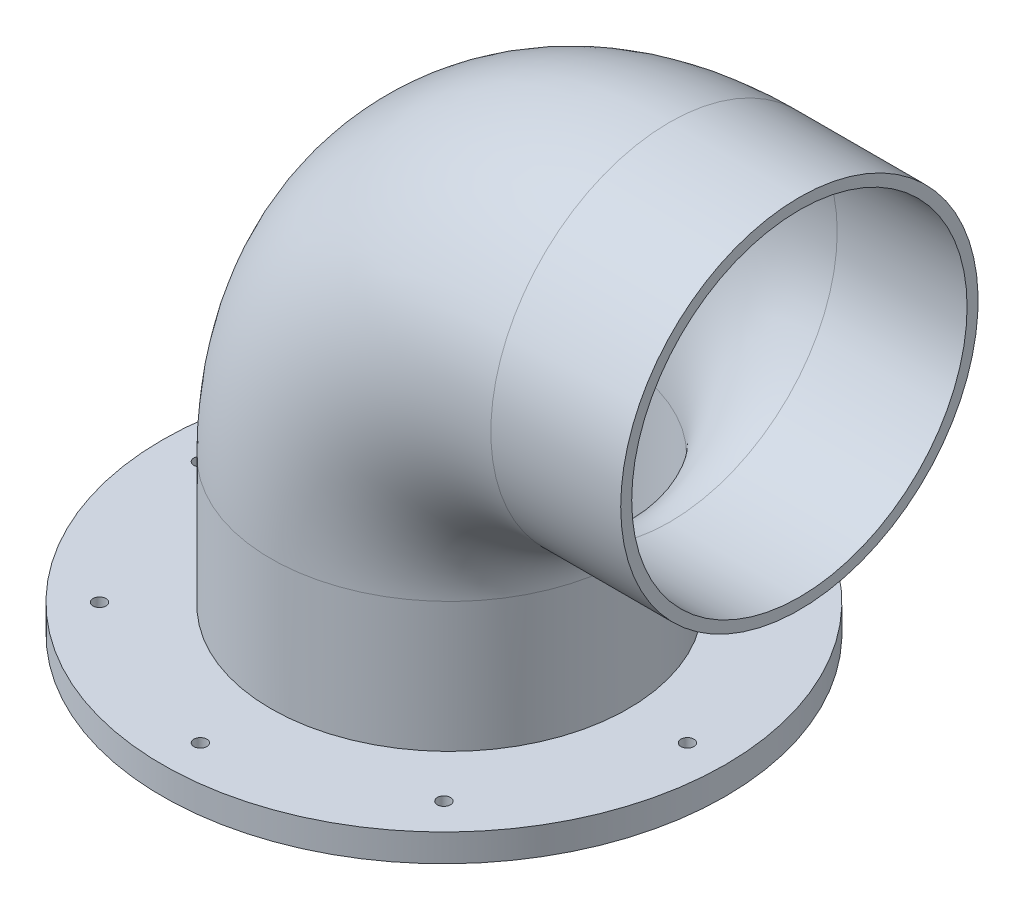
ISO-10303-21;
HEADER;
FILE_DESCRIPTION(('STEP AP214'),'2;1');
FILE_NAME('part.step','',(''),(''),'','','');
FILE_SCHEMA(('AUTOMOTIVE_DESIGN { 1 0 10303 214 1 1 1 1 }'));
ENDSEC;
DATA;
#1=APPLICATION_CONTEXT('core data for automotive mechanical design processes');
#2=APPLICATION_PROTOCOL_DEFINITION('international standard','automotive_design',2000,#1);
#3=PRODUCT_CONTEXT('',#1,'mechanical');
#4=PRODUCT('Part','Part','',(#3));
#5=PRODUCT_RELATED_PRODUCT_CATEGORY('part','',(#4));
#6=PRODUCT_DEFINITION_FORMATION('','',#4);
#7=PRODUCT_DEFINITION_CONTEXT('part definition',#1,'design');
#8=PRODUCT_DEFINITION('design','',#6,#7);
#9=PRODUCT_DEFINITION_SHAPE('','',#8);
#10=(LENGTH_UNIT() NAMED_UNIT(*) SI_UNIT(.MILLI.,.METRE.));
#11=(NAMED_UNIT(*) PLANE_ANGLE_UNIT() SI_UNIT($,.RADIAN.));
#12=(NAMED_UNIT(*) SI_UNIT($,.STERADIAN.) SOLID_ANGLE_UNIT());
#13=UNCERTAINTY_MEASURE_WITH_UNIT(LENGTH_MEASURE(1.E-05),#10,'distance_accuracy_value','');
#14=(GEOMETRIC_REPRESENTATION_CONTEXT(3) GLOBAL_UNCERTAINTY_ASSIGNED_CONTEXT((#13)) GLOBAL_UNIT_ASSIGNED_CONTEXT((#10,
#11,#12)) REPRESENTATION_CONTEXT('',''));
#15=CARTESIAN_POINT('',(0.,0.,0.));
#16=DIRECTION('',(0.,0.,1.));
#17=DIRECTION('',(1.,0.,0.));
#18=AXIS2_PLACEMENT_3D('',#15,#16,#17);
#19=CARTESIAN_POINT('',(82.1134168642502,92.3007855995872,0.));
#20=DIRECTION('',(-1.,0.,0.));
#21=DIRECTION('',(0.,0.,1.));
#22=AXIS2_PLACEMENT_3D('',#19,#20,#21);
#23=PLANE('',#22);
#24=CARTESIAN_POINT('',(82.1134168642502,92.3007855995872,0.));
#25=DIRECTION('',(-1.,0.,0.));
#26=DIRECTION('',(0.,0.,1.));
#27=AXIS2_PLACEMENT_3D('',#24,#25,#26);
#28=CIRCLE('',#27,38.735);
#29=CARTESIAN_POINT('',(82.1134168642502,92.3007855995872,38.735));
#30=VERTEX_POINT('',#29);
#31=EDGE_CURVE('E98',#30,#30,#28,.T.);
#32=ORIENTED_EDGE('',*,*,#31,.T.);
#33=EDGE_LOOP('',(#32));
#34=FACE_BOUND('',#33,.T.);
#35=CARTESIAN_POINT('',(82.1134168642502,92.3007855995872,0.));
#36=DIRECTION('',(-1.,0.,0.));
#37=DIRECTION('',(0.,0.,1.));
#38=AXIS2_PLACEMENT_3D('',#35,#36,#37);
#39=CIRCLE('',#38,41.275);
#40=CARTESIAN_POINT('',(82.1134168642502,92.3007855995872,41.275));
#41=VERTEX_POINT('',#40);
#42=EDGE_CURVE('E12',#41,#41,#39,.T.);
#43=ORIENTED_EDGE('',*,*,#42,.F.);
#44=EDGE_LOOP('',(#43));
#45=FACE_BOUND('',#44,.T.);
#46=ADVANCED_FACE('F57',(#34,#45),#23,.F.);
#47=CARTESIAN_POINT('',(1.31341686425018,11.5007855995872,0.));
#48=DIRECTION('',(0.,1.,0.));
#49=DIRECTION('',(-1.,0.,0.));
#50=AXIS2_PLACEMENT_3D('',#47,#48,#49);
#51=CYLINDRICAL_SURFACE('',#50,41.275);
#52=CARTESIAN_POINT('',(1.31341686425017,41.5007855995872,0.));
#53=DIRECTION('',(0.,-1.,0.));
#54=DIRECTION('',(0.,0.,1.));
#55=AXIS2_PLACEMENT_3D('',#52,#53,#54);
#56=CIRCLE('',#55,41.275);
#57=CARTESIAN_POINT('',(-39.9615831357498,41.5007855995872,0.));
#58=VERTEX_POINT('',#57);
#59=EDGE_CURVE('E104',#58,#58,#56,.T.);
#60=ORIENTED_EDGE('',*,*,#59,.T.);
#61=EDGE_LOOP('',(#60));
#62=FACE_BOUND('',#61,.T.);
#63=CARTESIAN_POINT('',(1.31341686425018,11.5007855995872,0.));
#64=DIRECTION('',(0.,-1.,0.));
#65=DIRECTION('',(0.,0.,1.));
#66=AXIS2_PLACEMENT_3D('',#63,#64,#65);
#67=CIRCLE('',#66,41.275);
#68=CARTESIAN_POINT('',(1.31341686425018,11.5007855995872,41.275));
#69=VERTEX_POINT('',#68);
#70=EDGE_CURVE('E101',#69,#69,#67,.T.);
#71=ORIENTED_EDGE('',*,*,#70,.F.);
#72=EDGE_LOOP('',(#71));
#73=FACE_BOUND('',#72,.T.);
#74=ADVANCED_FACE('F123',(#62,#73),#51,.T.);
#75=CARTESIAN_POINT('',(52.1134168642502,41.5007855995872,0.));
#76=DIRECTION('',(0.,0.,-1.));
#77=DIRECTION('',(-1.,0.,0.));
#78=AXIS2_PLACEMENT_3D('',#75,#76,#77);
#79=TOROIDAL_SURFACE('',#78,50.8,41.275);
#80=CARTESIAN_POINT('',(52.1134168642502,92.3007855995873,0.));
#81=DIRECTION('',(-1.,0.,0.));
#82=DIRECTION('',(0.,0.,1.));
#83=AXIS2_PLACEMENT_3D('',#80,#81,#82);
#84=CIRCLE('',#83,41.275);
#85=CARTESIAN_POINT('',(52.1134168642502,133.575785599587,0.));
#86=VERTEX_POINT('',#85);
#87=EDGE_CURVE('E64',#86,#86,#84,.T.);
#88=CARTESIAN_POINT('',(52.1134168642502,41.5007855995872,0.));
#89=DIRECTION('',(0.,0.,-1.));
#90=DIRECTION('',(-1.,0.,0.));
#91=AXIS2_PLACEMENT_3D('',#88,#89,#90);
#92=CIRCLE('',#91,92.075);
#93=EDGE_CURVE('',#58,#86,#92,.T.);
#94=ORIENTED_EDGE('',*,*,#59,.F.);
#95=ORIENTED_EDGE('',*,*,#87,.T.);
#96=ORIENTED_EDGE('',*,*,#93,.T.);
#97=ORIENTED_EDGE('',*,*,#93,.F.);
#98=EDGE_LOOP('',(#94,#96,#95,#97));
#99=FACE_BOUND('',#98,.T.);
#100=ADVANCED_FACE('F109',(#99),#79,.T.);
#101=CARTESIAN_POINT('',(52.1134168642502,92.3007855995872,0.));
#102=DIRECTION('',(1.,0.,0.));
#103=DIRECTION('',(0.,0.,-1.));
#104=AXIS2_PLACEMENT_3D('',#101,#102,#103);
#105=CYLINDRICAL_SURFACE('',#104,41.275);
#106=ORIENTED_EDGE('',*,*,#42,.T.);
#107=EDGE_LOOP('',(#106));
#108=FACE_BOUND('',#107,.T.);
#109=ORIENTED_EDGE('',*,*,#87,.F.);
#110=EDGE_LOOP('',(#109));
#111=FACE_BOUND('',#110,.T.);
#112=ADVANCED_FACE('F112',(#108,#111),#105,.T.);
#113=CARTESIAN_POINT('',(1.31341686425018,11.5007855995872,0.));
#114=DIRECTION('',(0.,1.,0.));
#115=DIRECTION('',(-1.,0.,0.));
#116=AXIS2_PLACEMENT_3D('',#113,#114,#115);
#117=CYLINDRICAL_SURFACE('',#116,38.735);
#118=CARTESIAN_POINT('',(1.31341686425017,41.5007855995872,0.));
#119=DIRECTION('',(0.,1.,0.));
#120=DIRECTION('',(-1.,0.,0.));
#121=AXIS2_PLACEMENT_3D('',#118,#119,#120);
#122=CIRCLE('',#121,38.735);
#123=CARTESIAN_POINT('',(-37.4215831357498,41.5007855995872,0.));
#124=VERTEX_POINT('',#123);
#125=EDGE_CURVE('E92',#124,#124,#122,.F.);
#126=ORIENTED_EDGE('',*,*,#125,.F.);
#127=EDGE_LOOP('',(#126));
#128=FACE_BOUND('',#127,.T.);
#129=CARTESIAN_POINT('',(1.31341686425018,11.5007855995872,0.));
#130=DIRECTION('',(0.,-1.,0.));
#131=DIRECTION('',(1.,0.,0.));
#132=AXIS2_PLACEMENT_3D('',#129,#130,#131);
#133=CIRCLE('',#132,38.735);
#134=CARTESIAN_POINT('',(-17.9170689907245,11.5007855995872,33.6242269618443));
#135=VERTEX_POINT('',#134);
#136=CARTESIAN_POINT('',(-17.9170689907245,11.5007855995872,-33.6242269618444));
#137=VERTEX_POINT('',#136);
#138=EDGE_CURVE('E84',#135,#137,#133,.T.);
#139=ORIENTED_EDGE('',*,*,#138,.T.);
#140=EDGE_CURVE('E86',#137,#135,#133,.T.);
#141=ORIENTED_EDGE('',*,*,#140,.T.);
#142=EDGE_LOOP('',(#139,#141));
#143=FACE_BOUND('',#142,.T.);
#144=ADVANCED_FACE('F91',(#128,#143),#117,.F.);
#145=CARTESIAN_POINT('',(52.1134168642502,41.5007855995872,0.));
#146=DIRECTION('',(0.,0.,-1.));
#147=DIRECTION('',(-1.,0.,0.));
#148=AXIS2_PLACEMENT_3D('',#145,#146,#147);
#149=TOROIDAL_SURFACE('',#148,50.8,38.735);
#150=CARTESIAN_POINT('',(52.1134168642502,92.3007855995872,0.));
#151=DIRECTION('',(-1.,0.,0.));
#152=DIRECTION('',(0.,-1.,0.));
#153=AXIS2_PLACEMENT_3D('',#150,#151,#152);
#154=CIRCLE('',#153,38.735);
#155=CARTESIAN_POINT('',(52.1134168642502,131.035785599587,0.));
#156=VERTEX_POINT('',#155);
#157=EDGE_CURVE('E94',#156,#156,#154,.T.);
#158=CARTESIAN_POINT('',(52.1134168642502,41.5007855995872,0.));
#159=DIRECTION('',(0.,0.,-1.));
#160=DIRECTION('',(-1.,0.,0.));
#161=AXIS2_PLACEMENT_3D('',#158,#159,#160);
#162=CIRCLE('',#161,89.535);
#163=EDGE_CURVE('',#124,#156,#162,.T.);
#164=ORIENTED_EDGE('',*,*,#125,.T.);
#165=ORIENTED_EDGE('',*,*,#157,.F.);
#166=ORIENTED_EDGE('',*,*,#163,.T.);
#167=ORIENTED_EDGE('',*,*,#163,.F.);
#168=EDGE_LOOP('',(#164,#166,#165,#167));
#169=FACE_BOUND('',#168,.T.);
#170=ADVANCED_FACE('F119',(#169),#149,.F.);
#171=CARTESIAN_POINT('',(52.1134168642502,92.3007855995872,0.));
#172=DIRECTION('',(1.,0.,0.));
#173=DIRECTION('',(0.,0.,-1.));
#174=AXIS2_PLACEMENT_3D('',#171,#172,#173);
#175=CYLINDRICAL_SURFACE('',#174,38.735);
#176=ORIENTED_EDGE('',*,*,#31,.F.);
#177=EDGE_LOOP('',(#176));
#178=FACE_BOUND('',#177,.T.);
#179=ORIENTED_EDGE('',*,*,#157,.T.);
#180=EDGE_LOOP('',(#179));
#181=FACE_BOUND('',#180,.T.);
#182=ADVANCED_FACE('F129',(#178,#181),#175,.F.);
#183=CARTESIAN_POINT('',(0.,11.5007855995872,0.));
#184=DIRECTION('',(0.,-1.,0.));
#185=DIRECTION('',(1.,0.,0.));
#186=AXIS2_PLACEMENT_3D('',#183,#184,#185);
#187=PLANE('',#186);
#188=CARTESIAN_POINT('',(-56.25,11.5007855995872,-1.96395825309926E-13));
#189=DIRECTION('',(0.,-1.,0.));
#190=DIRECTION('',(1.,0.,0.));
#191=AXIS2_PLACEMENT_3D('',#188,#189,#190);
#192=CIRCLE('',#191,1.5);
#193=CARTESIAN_POINT('',(-54.75,11.5007855995872,-1.96395825309926E-13));
#194=VERTEX_POINT('',#193);
#195=EDGE_CURVE('E208',#194,#194,#192,.T.);
#196=ORIENTED_EDGE('',*,*,#195,.T.);
#197=EDGE_LOOP('',(#196));
#198=FACE_BOUND('',#197,.T.);
#199=CARTESIAN_POINT('',(-39.7747564417431,11.5007855995872,-39.7747564417435));
#200=DIRECTION('',(0.,-1.,0.));
#201=DIRECTION('',(1.,0.,0.));
#202=AXIS2_PLACEMENT_3D('',#199,#200,#201);
#203=CIRCLE('',#202,1.5);
#204=CARTESIAN_POINT('',(-38.2747564417431,11.5007855995872,-39.7747564417435));
#205=VERTEX_POINT('',#204);
#206=EDGE_CURVE('E205',#205,#205,#203,.T.);
#207=ORIENTED_EDGE('',*,*,#206,.T.);
#208=EDGE_LOOP('',(#207));
#209=FACE_BOUND('',#208,.T.);
#210=CARTESIAN_POINT('',(0.,11.5007855995872,-56.25));
#211=DIRECTION('',(0.,-1.,0.));
#212=DIRECTION('',(1.,0.,0.));
#213=AXIS2_PLACEMENT_3D('',#210,#211,#212);
#214=CIRCLE('',#213,1.5);
#215=CARTESIAN_POINT('',(1.5,11.5007855995872,-56.25));
#216=VERTEX_POINT('',#215);
#217=EDGE_CURVE('E196',#216,#216,#214,.T.);
#218=ORIENTED_EDGE('',*,*,#217,.T.);
#219=EDGE_LOOP('',(#218));
#220=FACE_BOUND('',#219,.T.);
#221=CARTESIAN_POINT('',(39.7747564417436,11.5007855995872,-39.774756441743));
#222=DIRECTION('',(0.,-1.,0.));
#223=DIRECTION('',(1.,0.,0.));
#224=AXIS2_PLACEMENT_3D('',#221,#222,#223);
#225=CIRCLE('',#224,1.5);
#226=CARTESIAN_POINT('',(41.2747564417436,11.5007855995872,-39.774756441743));
#227=VERTEX_POINT('',#226);
#228=EDGE_CURVE('E192',#227,#227,#225,.T.);
#229=ORIENTED_EDGE('',*,*,#228,.T.);
#230=EDGE_LOOP('',(#229));
#231=FACE_BOUND('',#230,.T.);
#232=CARTESIAN_POINT('',(56.25,11.5007855995872,5.89187475929779E-13));
#233=DIRECTION('',(0.,-1.,0.));
#234=DIRECTION('',(1.,0.,0.));
#235=AXIS2_PLACEMENT_3D('',#232,#233,#234);
#236=CIRCLE('',#235,1.5);
#237=CARTESIAN_POINT('',(57.75,11.5007855995872,5.89187475929779E-13));
#238=VERTEX_POINT('',#237);
#239=EDGE_CURVE('E190',#238,#238,#236,.T.);
#240=ORIENTED_EDGE('',*,*,#239,.T.);
#241=EDGE_LOOP('',(#240));
#242=FACE_BOUND('',#241,.T.);
#243=CARTESIAN_POINT('',(39.7747564417428,11.5007855995872,39.7747564417438));
#244=DIRECTION('',(0.,-1.,0.));
#245=DIRECTION('',(1.,0.,0.));
#246=AXIS2_PLACEMENT_3D('',#243,#244,#245);
#247=CIRCLE('',#246,1.5);
#248=CARTESIAN_POINT('',(41.2747564417428,11.5007855995872,39.7747564417438));
#249=VERTEX_POINT('',#248);
#250=EDGE_CURVE('E193',#249,#249,#247,.T.);
#251=ORIENTED_EDGE('',*,*,#250,.T.);
#252=EDGE_LOOP('',(#251));
#253=FACE_BOUND('',#252,.T.);
#254=CARTESIAN_POINT('',(-39.7747564417434,11.5007855995872,39.7747564417432));
#255=DIRECTION('',(0.,-1.,0.));
#256=DIRECTION('',(1.,0.,0.));
#257=AXIS2_PLACEMENT_3D('',#254,#255,#256);
#258=CIRCLE('',#257,1.5);
#259=CARTESIAN_POINT('',(-38.2747564417434,11.5007855995872,39.7747564417432));
#260=VERTEX_POINT('',#259);
#261=EDGE_CURVE('E199',#260,#260,#258,.T.);
#262=ORIENTED_EDGE('',*,*,#261,.T.);
#263=EDGE_LOOP('',(#262));
#264=FACE_BOUND('',#263,.T.);
#265=CARTESIAN_POINT('',(0.,11.5007855995872,56.25));
#266=DIRECTION('',(0.,-1.,0.));
#267=DIRECTION('',(1.,0.,0.));
#268=AXIS2_PLACEMENT_3D('',#265,#266,#267);
#269=CIRCLE('',#268,1.5);
#270=CARTESIAN_POINT('',(1.5,11.5007855995872,56.25));
#271=VERTEX_POINT('',#270);
#272=EDGE_CURVE('E214',#271,#271,#269,.T.);
#273=ORIENTED_EDGE('',*,*,#272,.T.);
#274=EDGE_LOOP('',(#273));
#275=FACE_BOUND('',#274,.T.);
#276=ORIENTED_EDGE('',*,*,#70,.T.);
#277=EDGE_LOOP('',(#276));
#278=FACE_BOUND('',#277,.T.);
#279=CARTESIAN_POINT('',(0.,11.5007855995872,0.));
#280=DIRECTION('',(0.,-1.,0.));
#281=DIRECTION('',(1.,0.,0.));
#282=AXIS2_PLACEMENT_3D('',#279,#280,#281);
#283=CIRCLE('',#282,65.);
#284=CARTESIAN_POINT('',(65.,11.5007855995872,0.));
#285=VERTEX_POINT('',#284);
#286=EDGE_CURVE('E85',#285,#285,#283,.T.);
#287=ORIENTED_EDGE('',*,*,#286,.F.);
#288=EDGE_LOOP('',(#287));
#289=FACE_BOUND('',#288,.T.);
#290=ADVANCED_FACE('F122',(#198,#209,#220,#231,#242,#253,#264,#275,#278,#289),#187,.F.);
#291=CARTESIAN_POINT('',(0.,5.15078559958724,0.));
#292=DIRECTION('',(0.,-1.,0.));
#293=DIRECTION('',(1.,0.,0.));
#294=AXIS2_PLACEMENT_3D('',#291,#292,#293);
#295=PLANE('',#294);
#296=CARTESIAN_POINT('',(-56.25,5.15078559958725,-1.96395825309926E-13));
#297=DIRECTION('',(0.,-1.,0.));
#298=DIRECTION('',(0.,0.,1.));
#299=AXIS2_PLACEMENT_3D('',#296,#297,#298);
#300=CIRCLE('',#299,1.5);
#301=CARTESIAN_POINT('',(-56.25,5.15078559958725,1.4999999999998));
#302=VERTEX_POINT('',#301);
#303=EDGE_CURVE('E253',#302,#302,#300,.T.);
#304=ORIENTED_EDGE('',*,*,#303,.F.);
#305=EDGE_LOOP('',(#304));
#306=FACE_BOUND('',#305,.T.);
#307=CARTESIAN_POINT('',(-39.7747564417431,5.15078559958725,-39.7747564417435));
#308=DIRECTION('',(0.,-1.,0.));
#309=DIRECTION('',(-0.707106781186551,0.,0.707106781186544));
#310=AXIS2_PLACEMENT_3D('',#307,#308,#309);
#311=CIRCLE('',#310,1.5);
#312=CARTESIAN_POINT('',(-40.8354166135229,5.15078559958725,-38.7140962699637));
#313=VERTEX_POINT('',#312);
#314=EDGE_CURVE('E262',#313,#313,#311,.T.);
#315=ORIENTED_EDGE('',*,*,#314,.F.);
#316=EDGE_LOOP('',(#315));
#317=FACE_BOUND('',#316,.T.);
#318=CARTESIAN_POINT('',(0.,5.15078559958724,-56.25));
#319=DIRECTION('',(0.,-1.,0.));
#320=DIRECTION('',(-1.,0.,0.));
#321=AXIS2_PLACEMENT_3D('',#318,#319,#320);
#322=CIRCLE('',#321,1.5);
#323=CARTESIAN_POINT('',(-1.5,5.15078559958724,-56.25));
#324=VERTEX_POINT('',#323);
#325=EDGE_CURVE('E259',#324,#324,#322,.T.);
#326=ORIENTED_EDGE('',*,*,#325,.F.);
#327=EDGE_LOOP('',(#326));
#328=FACE_BOUND('',#327,.T.);
#329=CARTESIAN_POINT('',(39.7747564417436,5.15078559958723,-39.774756441743));
#330=DIRECTION('',(0.,-1.,0.));
#331=DIRECTION('',(-0.707106781186541,0.,-0.707106781186554));
#332=AXIS2_PLACEMENT_3D('',#329,#330,#331);
#333=CIRCLE('',#332,1.5);
#334=CARTESIAN_POINT('',(38.7140962699638,5.15078559958723,-40.8354166135228));
#335=VERTEX_POINT('',#334);
#336=EDGE_CURVE('E256',#335,#335,#333,.T.);
#337=ORIENTED_EDGE('',*,*,#336,.F.);
#338=EDGE_LOOP('',(#337));
#339=FACE_BOUND('',#338,.T.);
#340=CARTESIAN_POINT('',(56.25,5.15078559958723,5.89187475929779E-13));
#341=DIRECTION('',(0.,-1.,0.));
#342=DIRECTION('',(0.,0.,-1.));
#343=AXIS2_PLACEMENT_3D('',#340,#341,#342);
#344=CIRCLE('',#343,1.5);
#345=CARTESIAN_POINT('',(56.25,5.15078559958723,-1.49999999999941));
#346=VERTEX_POINT('',#345);
#347=EDGE_CURVE('E187',#346,#346,#344,.T.);
#348=ORIENTED_EDGE('',*,*,#347,.F.);
#349=EDGE_LOOP('',(#348));
#350=FACE_BOUND('',#349,.T.);
#351=CARTESIAN_POINT('',(39.7747564417428,5.15078559958723,39.7747564417438));
#352=DIRECTION('',(0.,-1.,0.));
#353=DIRECTION('',(0.707106781186556,0.,-0.707106781186539));
#354=AXIS2_PLACEMENT_3D('',#351,#352,#353);
#355=CIRCLE('',#354,1.5);
#356=CARTESIAN_POINT('',(40.8354166135226,5.15078559958723,38.714096269964));
#357=VERTEX_POINT('',#356);
#358=EDGE_CURVE('E267',#357,#357,#355,.T.);
#359=ORIENTED_EDGE('',*,*,#358,.F.);
#360=EDGE_LOOP('',(#359));
#361=FACE_BOUND('',#360,.T.);
#362=CARTESIAN_POINT('',(-39.7747564417434,5.15078559958725,39.7747564417432));
#363=DIRECTION('',(0.,-1.,0.));
#364=DIRECTION('',(0.707106781186546,0.,0.707106781186549));
#365=AXIS2_PLACEMENT_3D('',#362,#363,#364);
#366=CIRCLE('',#365,1.5);
#367=CARTESIAN_POINT('',(-38.7140962699636,5.15078559958725,40.8354166135231));
#368=VERTEX_POINT('',#367);
#369=EDGE_CURVE('E251',#368,#368,#366,.T.);
#370=ORIENTED_EDGE('',*,*,#369,.F.);
#371=EDGE_LOOP('',(#370));
#372=FACE_BOUND('',#371,.T.);
#373=CARTESIAN_POINT('',(0.,5.15078559958724,56.25));
#374=DIRECTION('',(0.,-1.,0.));
#375=DIRECTION('',(1.,0.,0.));
#376=AXIS2_PLACEMENT_3D('',#373,#374,#375);
#377=CIRCLE('',#376,1.5);
#378=CARTESIAN_POINT('',(1.5,5.15078559958724,56.25));
#379=VERTEX_POINT('',#378);
#380=EDGE_CURVE('E211',#379,#379,#377,.T.);
#381=ORIENTED_EDGE('',*,*,#380,.F.);
#382=EDGE_LOOP('',(#381));
#383=FACE_BOUND('',#382,.T.);
#384=CARTESIAN_POINT('',(0.,5.15078559958724,0.));
#385=DIRECTION('',(0.,-1.,0.));
#386=DIRECTION('',(1.,0.,0.));
#387=AXIS2_PLACEMENT_3D('',#384,#385,#386);
#388=CIRCLE('',#387,38.1);
#389=CARTESIAN_POINT('',(38.1,5.15078559958723,0.));
#390=VERTEX_POINT('',#389);
#391=EDGE_CURVE('E79',#390,#390,#388,.T.);
#392=ORIENTED_EDGE('',*,*,#391,.F.);
#393=EDGE_LOOP('',(#392));
#394=FACE_BOUND('',#393,.T.);
#395=CARTESIAN_POINT('',(0.,5.15078559958724,0.));
#396=DIRECTION('',(0.,-1.,0.));
#397=DIRECTION('',(1.,0.,0.));
#398=AXIS2_PLACEMENT_3D('',#395,#396,#397);
#399=CIRCLE('',#398,65.);
#400=CARTESIAN_POINT('',(65.,5.15078559958723,0.));
#401=VERTEX_POINT('',#400);
#402=EDGE_CURVE('E89',#401,#401,#399,.T.);
#403=ORIENTED_EDGE('',*,*,#402,.T.);
#404=EDGE_LOOP('',(#403));
#405=FACE_BOUND('',#404,.T.);
#406=ADVANCED_FACE('F139',(#306,#317,#328,#339,#350,#361,#372,#383,#394,#405),#295,.T.);
#407=CARTESIAN_POINT('',(0.,5.15078559958724,0.));
#408=DIRECTION('',(0.,1.,0.));
#409=DIRECTION('',(-1.,0.,0.));
#410=AXIS2_PLACEMENT_3D('',#407,#408,#409);
#411=CYLINDRICAL_SURFACE('',#410,65.);
#412=ORIENTED_EDGE('',*,*,#402,.F.);
#413=EDGE_LOOP('',(#412));
#414=FACE_BOUND('',#413,.T.);
#415=ORIENTED_EDGE('',*,*,#286,.T.);
#416=EDGE_LOOP('',(#415));
#417=FACE_BOUND('',#416,.T.);
#418=ADVANCED_FACE('F136',(#414,#417),#411,.T.);
#419=ORIENTED_EDGE('',*,*,#140,.F.);
#420=CARTESIAN_POINT('',(0.,11.5007855995872,0.));
#421=DIRECTION('',(0.,-1.,0.));
#422=DIRECTION('',(1.,0.,0.));
#423=AXIS2_PLACEMENT_3D('',#420,#421,#422);
#424=CIRCLE('',#423,38.1);
#425=EDGE_CURVE('E73',#137,#135,#424,.T.);
#426=ORIENTED_EDGE('',*,*,#425,.T.);
#427=EDGE_LOOP('',(#419,#426));
#428=FACE_BOUND('',#427,.T.);
#429=ADVANCED_FACE('F87',(#428),#187,.F.);
#430=CARTESIAN_POINT('',(0.,11.5007855995872,0.));
#431=DIRECTION('',(0.,-1.,0.));
#432=DIRECTION('',(1.,0.,0.));
#433=AXIS2_PLACEMENT_3D('',#430,#431,#432);
#434=CYLINDRICAL_SURFACE('',#433,38.1);
#435=EDGE_CURVE('E70',#135,#137,#424,.T.);
#436=ORIENTED_EDGE('',*,*,#435,.F.);
#437=ORIENTED_EDGE('',*,*,#425,.F.);
#438=EDGE_LOOP('',(#436,#437));
#439=FACE_BOUND('',#438,.T.);
#440=ORIENTED_EDGE('',*,*,#391,.T.);
#441=EDGE_LOOP('',(#440));
#442=FACE_BOUND('',#441,.T.);
#443=ADVANCED_FACE('F74',(#439,#442),#434,.F.);
#444=CARTESIAN_POINT('',(0.,11.5007855995872,0.));
#445=DIRECTION('',(0.,-1.,0.));
#446=DIRECTION('',(1.,0.,0.));
#447=AXIS2_PLACEMENT_3D('',#444,#445,#446);
#448=PLANE('',#447);
#449=ORIENTED_EDGE('',*,*,#435,.T.);
#450=ORIENTED_EDGE('',*,*,#138,.F.);
#451=EDGE_LOOP('',(#449,#450));
#452=FACE_BOUND('',#451,.T.);
#453=ADVANCED_FACE('F82',(#452),#448,.T.);
#454=CARTESIAN_POINT('',(0.,15.1507855995872,56.25));
#455=DIRECTION('',(0.,-1.,0.));
#456=DIRECTION('',(1.,0.,0.));
#457=AXIS2_PLACEMENT_3D('',#454,#455,#456);
#458=CYLINDRICAL_SURFACE('',#457,1.5);
#459=ORIENTED_EDGE('',*,*,#380,.T.);
#460=EDGE_LOOP('',(#459));
#461=FACE_BOUND('',#460,.T.);
#462=ORIENTED_EDGE('',*,*,#272,.F.);
#463=EDGE_LOOP('',(#462));
#464=FACE_BOUND('',#463,.T.);
#465=ADVANCED_FACE('F151',(#461,#464),#458,.F.);
#466=CARTESIAN_POINT('',(-39.7747564417434,15.1507855995872,39.7747564417432));
#467=DIRECTION('',(0.,-1.,0.));
#468=DIRECTION('',(1.,0.,0.));
#469=AXIS2_PLACEMENT_3D('',#466,#467,#468);
#470=CYLINDRICAL_SURFACE('',#469,1.5);
#471=ORIENTED_EDGE('',*,*,#369,.T.);
#472=EDGE_LOOP('',(#471));
#473=FACE_BOUND('',#472,.T.);
#474=ORIENTED_EDGE('',*,*,#261,.F.);
#475=EDGE_LOOP('',(#474));
#476=FACE_BOUND('',#475,.T.);
#477=ADVANCED_FACE('F154',(#473,#476),#470,.F.);
#478=CARTESIAN_POINT('',(39.7747564417428,15.1507855995872,39.7747564417438));
#479=DIRECTION('',(0.,-1.,0.));
#480=DIRECTION('',(1.,0.,0.));
#481=AXIS2_PLACEMENT_3D('',#478,#479,#480);
#482=CYLINDRICAL_SURFACE('',#481,1.5);
#483=ORIENTED_EDGE('',*,*,#358,.T.);
#484=EDGE_LOOP('',(#483));
#485=FACE_BOUND('',#484,.T.);
#486=ORIENTED_EDGE('',*,*,#250,.F.);
#487=EDGE_LOOP('',(#486));
#488=FACE_BOUND('',#487,.T.);
#489=ADVANCED_FACE('F158',(#485,#488),#482,.F.);
#490=CARTESIAN_POINT('',(56.25,15.1507855995872,5.89187475929779E-13));
#491=DIRECTION('',(0.,-1.,0.));
#492=DIRECTION('',(1.,0.,0.));
#493=AXIS2_PLACEMENT_3D('',#490,#491,#492);
#494=CYLINDRICAL_SURFACE('',#493,1.5);
#495=ORIENTED_EDGE('',*,*,#347,.T.);
#496=EDGE_LOOP('',(#495));
#497=FACE_BOUND('',#496,.T.);
#498=ORIENTED_EDGE('',*,*,#239,.F.);
#499=EDGE_LOOP('',(#498));
#500=FACE_BOUND('',#499,.T.);
#501=ADVANCED_FACE('F164',(#497,#500),#494,.F.);
#502=CARTESIAN_POINT('',(39.7747564417436,15.1507855995872,-39.774756441743));
#503=DIRECTION('',(0.,-1.,0.));
#504=DIRECTION('',(1.,0.,0.));
#505=AXIS2_PLACEMENT_3D('',#502,#503,#504);
#506=CYLINDRICAL_SURFACE('',#505,1.5);
#507=ORIENTED_EDGE('',*,*,#336,.T.);
#508=EDGE_LOOP('',(#507));
#509=FACE_BOUND('',#508,.T.);
#510=ORIENTED_EDGE('',*,*,#228,.F.);
#511=EDGE_LOOP('',(#510));
#512=FACE_BOUND('',#511,.T.);
#513=ADVANCED_FACE('F160',(#509,#512),#506,.F.);
#514=CARTESIAN_POINT('',(0.,15.1507855995872,-56.25));
#515=DIRECTION('',(0.,-1.,0.));
#516=DIRECTION('',(1.,0.,0.));
#517=AXIS2_PLACEMENT_3D('',#514,#515,#516);
#518=CYLINDRICAL_SURFACE('',#517,1.5);
#519=ORIENTED_EDGE('',*,*,#325,.T.);
#520=EDGE_LOOP('',(#519));
#521=FACE_BOUND('',#520,.T.);
#522=ORIENTED_EDGE('',*,*,#217,.F.);
#523=EDGE_LOOP('',(#522));
#524=FACE_BOUND('',#523,.T.);
#525=ADVANCED_FACE('F163',(#521,#524),#518,.F.);
#526=CARTESIAN_POINT('',(-39.7747564417431,15.1507855995872,-39.7747564417435));
#527=DIRECTION('',(0.,-1.,0.));
#528=DIRECTION('',(1.,0.,0.));
#529=AXIS2_PLACEMENT_3D('',#526,#527,#528);
#530=CYLINDRICAL_SURFACE('',#529,1.5);
#531=ORIENTED_EDGE('',*,*,#314,.T.);
#532=EDGE_LOOP('',(#531));
#533=FACE_BOUND('',#532,.T.);
#534=ORIENTED_EDGE('',*,*,#206,.F.);
#535=EDGE_LOOP('',(#534));
#536=FACE_BOUND('',#535,.T.);
#537=ADVANCED_FACE('F168',(#533,#536),#530,.F.);
#538=CARTESIAN_POINT('',(-56.25,15.1507855995873,-1.96395825309926E-13));
#539=DIRECTION('',(0.,-1.,0.));
#540=DIRECTION('',(1.,0.,0.));
#541=AXIS2_PLACEMENT_3D('',#538,#539,#540);
#542=CYLINDRICAL_SURFACE('',#541,1.5);
#543=ORIENTED_EDGE('',*,*,#303,.T.);
#544=EDGE_LOOP('',(#543));
#545=FACE_BOUND('',#544,.T.);
#546=ORIENTED_EDGE('',*,*,#195,.F.);
#547=EDGE_LOOP('',(#546));
#548=FACE_BOUND('',#547,.T.);
#549=ADVANCED_FACE('F172',(#545,#548),#542,.F.);
#550=CLOSED_SHELL('',(#46,#74,#100,#112,#144,#170,#182,#290,#406,#418,#429,#443,#453,#465,#477,
#489,#501,#513,#525,#537,#549));
#551=MANIFOLD_SOLID_BREP('B2',#550);
#552=ADVANCED_BREP_SHAPE_REPRESENTATION('',(#18,#551),#14);
#553=SHAPE_DEFINITION_REPRESENTATION(#9,#552);
ENDSEC;
END-ISO-10303-21;
